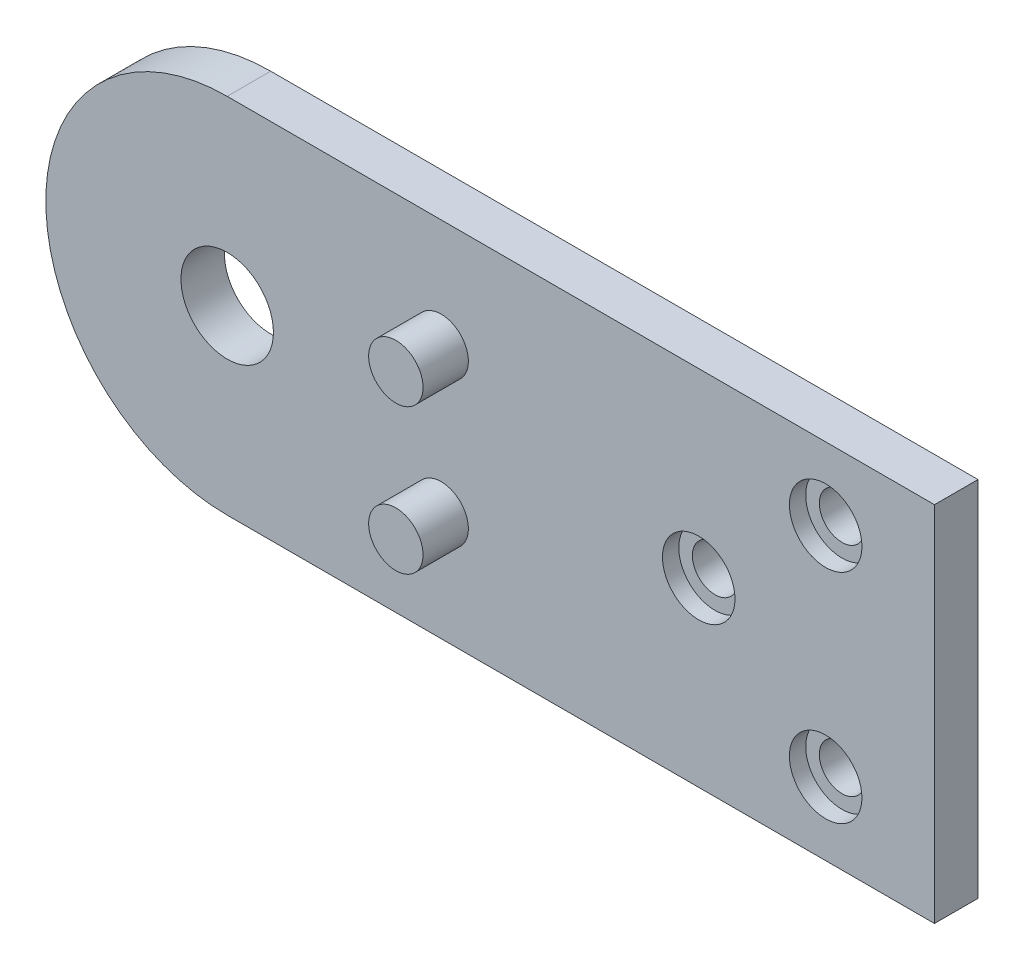
ISO-10303-21;
HEADER;
FILE_DESCRIPTION(('STEP AP214'),'2;1');
FILE_NAME('part.step','',(''),(''),'','','');
FILE_SCHEMA(('AUTOMOTIVE_DESIGN { 1 0 10303 214 1 1 1 1 }'));
ENDSEC;
DATA;
#1=APPLICATION_CONTEXT('core data for automotive mechanical design processes');
#2=APPLICATION_PROTOCOL_DEFINITION('international standard','automotive_design',2000,#1);
#3=PRODUCT_CONTEXT('',#1,'mechanical');
#4=PRODUCT('Part','Part','',(#3));
#5=PRODUCT_RELATED_PRODUCT_CATEGORY('part','',(#4));
#6=PRODUCT_DEFINITION_FORMATION('','',#4);
#7=PRODUCT_DEFINITION_CONTEXT('part definition',#1,'design');
#8=PRODUCT_DEFINITION('design','',#6,#7);
#9=PRODUCT_DEFINITION_SHAPE('','',#8);
#10=(LENGTH_UNIT() NAMED_UNIT(*) SI_UNIT(.MILLI.,.METRE.));
#11=(NAMED_UNIT(*) PLANE_ANGLE_UNIT() SI_UNIT($,.RADIAN.));
#12=(NAMED_UNIT(*) SI_UNIT($,.STERADIAN.) SOLID_ANGLE_UNIT());
#13=UNCERTAINTY_MEASURE_WITH_UNIT(LENGTH_MEASURE(1.E-05),#10,'distance_accuracy_value','');
#14=(GEOMETRIC_REPRESENTATION_CONTEXT(3) GLOBAL_UNCERTAINTY_ASSIGNED_CONTEXT((#13)) GLOBAL_UNIT_ASSIGNED_CONTEXT((#10,
#11,#12)) REPRESENTATION_CONTEXT('',''));
#15=CARTESIAN_POINT('',(0.,0.,0.));
#16=DIRECTION('',(0.,0.,1.));
#17=DIRECTION('',(1.,0.,0.));
#18=AXIS2_PLACEMENT_3D('',#15,#16,#17);
#19=CARTESIAN_POINT('',(26.,1.96131904388899E-12,2.4));
#20=DIRECTION('',(0.,0.,-1.));
#21=DIRECTION('',(-1.,0.,0.));
#22=AXIS2_PLACEMENT_3D('',#19,#20,#21);
#23=CYLINDRICAL_SURFACE('',#22,1.25);
#24=CARTESIAN_POINT('',(26.,1.96131904388899E-12,0.));
#25=DIRECTION('',(0.,0.,-1.));
#26=DIRECTION('',(-1.,0.,0.));
#27=AXIS2_PLACEMENT_3D('',#24,#25,#26);
#28=CIRCLE('',#27,1.25);
#29=CARTESIAN_POINT('',(24.75,1.96131904388899E-12,0.));
#30=VERTEX_POINT('',#29);
#31=EDGE_CURVE('E129',#30,#30,#28,.T.);
#32=ORIENTED_EDGE('',*,*,#31,.T.);
#33=EDGE_LOOP('',(#32));
#34=FACE_BOUND('',#33,.T.);
#35=CARTESIAN_POINT('',(26.,1.96131904388899E-12,1.5));
#36=DIRECTION('',(0.,0.,1.));
#37=DIRECTION('',(1.,0.,0.));
#38=AXIS2_PLACEMENT_3D('',#35,#36,#37);
#39=CIRCLE('',#38,1.25);
#40=CARTESIAN_POINT('',(27.25,1.96131904388899E-12,1.5));
#41=VERTEX_POINT('',#40);
#42=EDGE_CURVE('E138',#41,#41,#39,.F.);
#43=ORIENTED_EDGE('',*,*,#42,.F.);
#44=EDGE_LOOP('',(#43));
#45=FACE_BOUND('',#44,.T.);
#46=ADVANCED_FACE('F56',(#34,#45),#23,.F.);
#47=CARTESIAN_POINT('',(33.,-5.9999999999984,2.4));
#48=DIRECTION('',(0.,0.,-1.));
#49=DIRECTION('',(-1.,0.,0.));
#50=AXIS2_PLACEMENT_3D('',#47,#48,#49);
#51=CYLINDRICAL_SURFACE('',#50,1.25);
#52=CARTESIAN_POINT('',(33.,-5.9999999999984,0.));
#53=DIRECTION('',(0.,0.,-1.));
#54=DIRECTION('',(-1.,0.,0.));
#55=AXIS2_PLACEMENT_3D('',#52,#53,#54);
#56=CIRCLE('',#55,1.25);
#57=CARTESIAN_POINT('',(31.75,-5.9999999999984,0.));
#58=VERTEX_POINT('',#57);
#59=EDGE_CURVE('E132',#58,#58,#56,.T.);
#60=ORIENTED_EDGE('',*,*,#59,.T.);
#61=EDGE_LOOP('',(#60));
#62=FACE_BOUND('',#61,.T.);
#63=CARTESIAN_POINT('',(33.,-5.9999999999984,1.5));
#64=DIRECTION('',(0.,0.,1.));
#65=DIRECTION('',(1.,0.,0.));
#66=AXIS2_PLACEMENT_3D('',#63,#64,#65);
#67=CIRCLE('',#66,1.25);
#68=CARTESIAN_POINT('',(34.25,-5.9999999999984,1.5));
#69=VERTEX_POINT('',#68);
#70=EDGE_CURVE('E149',#69,#69,#67,.F.);
#71=ORIENTED_EDGE('',*,*,#70,.F.);
#72=EDGE_LOOP('',(#71));
#73=FACE_BOUND('',#72,.T.);
#74=ADVANCED_FACE('F214',(#62,#73),#51,.F.);
#75=CARTESIAN_POINT('',(33.,6.0000000000016,2.4));
#76=DIRECTION('',(0.,0.,-1.));
#77=DIRECTION('',(-1.,0.,0.));
#78=AXIS2_PLACEMENT_3D('',#75,#76,#77);
#79=CYLINDRICAL_SURFACE('',#78,1.25);
#80=CARTESIAN_POINT('',(33.,6.0000000000016,0.));
#81=DIRECTION('',(0.,0.,-1.));
#82=DIRECTION('',(-1.,0.,0.));
#83=AXIS2_PLACEMENT_3D('',#80,#81,#82);
#84=CIRCLE('',#83,1.25);
#85=CARTESIAN_POINT('',(31.75,6.0000000000016,0.));
#86=VERTEX_POINT('',#85);
#87=EDGE_CURVE('E120',#86,#86,#84,.T.);
#88=ORIENTED_EDGE('',*,*,#87,.T.);
#89=EDGE_LOOP('',(#88));
#90=FACE_BOUND('',#89,.T.);
#91=CARTESIAN_POINT('',(33.,6.0000000000016,1.5));
#92=DIRECTION('',(0.,0.,1.));
#93=DIRECTION('',(1.,0.,0.));
#94=AXIS2_PLACEMENT_3D('',#91,#92,#93);
#95=CIRCLE('',#94,1.25);
#96=CARTESIAN_POINT('',(34.25,6.0000000000016,1.5));
#97=VERTEX_POINT('',#96);
#98=EDGE_CURVE('E133',#97,#97,#95,.F.);
#99=ORIENTED_EDGE('',*,*,#98,.F.);
#100=EDGE_LOOP('',(#99));
#101=FACE_BOUND('',#100,.T.);
#102=ADVANCED_FACE('F220',(#90,#101),#79,.F.);
#103=CARTESIAN_POINT('',(0.,0.,0.));
#104=DIRECTION('',(0.,0.,1.));
#105=DIRECTION('',(1.,0.,0.));
#106=AXIS2_PLACEMENT_3D('',#103,#104,#105);
#107=PLANE('',#106);
#108=CARTESIAN_POINT('',(0.,0.,0.));
#109=DIRECTION('',(0.,0.,1.));
#110=DIRECTION('',(1.,0.,0.));
#111=AXIS2_PLACEMENT_3D('',#108,#109,#110);
#112=CIRCLE('',#111,2.55);
#113=CARTESIAN_POINT('',(2.55,0.,0.));
#114=VERTEX_POINT('',#113);
#115=EDGE_CURVE('E146',#114,#114,#112,.T.);
#116=ORIENTED_EDGE('',*,*,#115,.T.);
#117=EDGE_LOOP('',(#116));
#118=FACE_BOUND('',#117,.T.);
#119=ORIENTED_EDGE('',*,*,#87,.F.);
#120=EDGE_LOOP('',(#119));
#121=FACE_BOUND('',#120,.T.);
#122=ORIENTED_EDGE('',*,*,#59,.F.);
#123=EDGE_LOOP('',(#122));
#124=FACE_BOUND('',#123,.T.);
#125=ORIENTED_EDGE('',*,*,#31,.F.);
#126=EDGE_LOOP('',(#125));
#127=FACE_BOUND('',#126,.T.);
#128=CARTESIAN_POINT('',(0.,0.,0.));
#129=DIRECTION('',(0.,0.,1.));
#130=DIRECTION('',(1.,0.,0.));
#131=AXIS2_PLACEMENT_3D('',#128,#129,#130);
#132=CIRCLE('',#131,10.);
#133=CARTESIAN_POINT('',(0.,10.,0.));
#134=VERTEX_POINT('',#133);
#135=CARTESIAN_POINT('',(0.,-10.,0.));
#136=VERTEX_POINT('',#135);
#137=EDGE_CURVE('E113',#134,#136,#132,.T.);
#138=ORIENTED_EDGE('',*,*,#137,.F.);
#139=DIRECTION('',(1.,0.,0.));
#140=VECTOR('',#139,1.);
#141=CARTESIAN_POINT('',(0.,10.,0.));
#142=LINE('',#141,#140);
#143=CARTESIAN_POINT('',(39.,10.,0.));
#144=VERTEX_POINT('',#143);
#145=EDGE_CURVE('E100',#134,#144,#142,.T.);
#146=ORIENTED_EDGE('',*,*,#145,.T.);
#147=DIRECTION('',(0.,-1.,0.));
#148=VECTOR('',#147,1.);
#149=CARTESIAN_POINT('',(39.,10.,0.));
#150=LINE('',#149,#148);
#151=CARTESIAN_POINT('',(39.,-10.,0.));
#152=VERTEX_POINT('',#151);
#153=EDGE_CURVE('E106',#144,#152,#150,.T.);
#154=ORIENTED_EDGE('',*,*,#153,.T.);
#155=DIRECTION('',(1.,0.,0.));
#156=VECTOR('',#155,1.);
#157=CARTESIAN_POINT('',(0.,-10.,0.));
#158=LINE('',#157,#156);
#159=EDGE_CURVE('E110',#136,#152,#158,.T.);
#160=ORIENTED_EDGE('',*,*,#159,.F.);
#161=EDGE_LOOP('',(#138,#146,#154,#160));
#162=FACE_BOUND('',#161,.T.);
#163=ADVANCED_FACE('F112',(#118,#121,#124,#127,#162),#107,.F.);
#164=CARTESIAN_POINT('',(0.,0.,2.4));
#165=DIRECTION('',(0.,0.,1.));
#166=DIRECTION('',(1.,0.,0.));
#167=AXIS2_PLACEMENT_3D('',#164,#165,#166);
#168=PLANE('',#167);
#169=CARTESIAN_POINT('',(11.8,4.00000000000002,2.4));
#170=DIRECTION('',(0.,0.,1.));
#171=DIRECTION('',(1.,0.,0.));
#172=AXIS2_PLACEMENT_3D('',#169,#170,#171);
#173=CIRCLE('',#172,1.5);
#174=CARTESIAN_POINT('',(13.3,4.00000000000002,2.4));
#175=VERTEX_POINT('',#174);
#176=EDGE_CURVE('E174',#175,#175,#173,.T.);
#177=ORIENTED_EDGE('',*,*,#176,.F.);
#178=EDGE_LOOP('',(#177));
#179=FACE_BOUND('',#178,.T.);
#180=CARTESIAN_POINT('',(11.8,-3.99999999999998,2.4));
#181=DIRECTION('',(0.,0.,1.));
#182=DIRECTION('',(1.,0.,0.));
#183=AXIS2_PLACEMENT_3D('',#180,#181,#182);
#184=CIRCLE('',#183,1.5);
#185=CARTESIAN_POINT('',(13.3,-3.99999999999998,2.4));
#186=VERTEX_POINT('',#185);
#187=EDGE_CURVE('E171',#186,#186,#184,.T.);
#188=ORIENTED_EDGE('',*,*,#187,.F.);
#189=EDGE_LOOP('',(#188));
#190=FACE_BOUND('',#189,.T.);
#191=CARTESIAN_POINT('',(0.,0.,2.4));
#192=DIRECTION('',(0.,0.,1.));
#193=DIRECTION('',(1.,0.,0.));
#194=AXIS2_PLACEMENT_3D('',#191,#192,#193);
#195=CIRCLE('',#194,2.55);
#196=CARTESIAN_POINT('',(2.55,0.,2.4));
#197=VERTEX_POINT('',#196);
#198=EDGE_CURVE('E165',#197,#197,#195,.T.);
#199=ORIENTED_EDGE('',*,*,#198,.F.);
#200=EDGE_LOOP('',(#199));
#201=FACE_BOUND('',#200,.T.);
#202=CARTESIAN_POINT('',(33.,6.0000000000016,2.4));
#203=DIRECTION('',(0.,0.,1.));
#204=DIRECTION('',(1.,0.,0.));
#205=AXIS2_PLACEMENT_3D('',#202,#203,#204);
#206=CIRCLE('',#205,2.);
#207=CARTESIAN_POINT('',(35.,6.0000000000016,2.4));
#208=VERTEX_POINT('',#207);
#209=EDGE_CURVE('E152',#208,#208,#206,.T.);
#210=ORIENTED_EDGE('',*,*,#209,.F.);
#211=EDGE_LOOP('',(#210));
#212=FACE_BOUND('',#211,.T.);
#213=CARTESIAN_POINT('',(33.,-5.9999999999984,2.4));
#214=DIRECTION('',(0.,0.,1.));
#215=DIRECTION('',(1.,0.,0.));
#216=AXIS2_PLACEMENT_3D('',#213,#214,#215);
#217=CIRCLE('',#216,2.);
#218=CARTESIAN_POINT('',(35.,-5.9999999999984,2.4));
#219=VERTEX_POINT('',#218);
#220=EDGE_CURVE('E141',#219,#219,#217,.T.);
#221=ORIENTED_EDGE('',*,*,#220,.F.);
#222=EDGE_LOOP('',(#221));
#223=FACE_BOUND('',#222,.T.);
#224=CARTESIAN_POINT('',(26.,1.96131904388899E-12,2.4));
#225=DIRECTION('',(0.,0.,1.));
#226=DIRECTION('',(1.,0.,0.));
#227=AXIS2_PLACEMENT_3D('',#224,#225,#226);
#228=CIRCLE('',#227,2.);
#229=CARTESIAN_POINT('',(28.,1.96131904388899E-12,2.4));
#230=VERTEX_POINT('',#229);
#231=EDGE_CURVE('E143',#230,#230,#228,.T.);
#232=ORIENTED_EDGE('',*,*,#231,.F.);
#233=EDGE_LOOP('',(#232));
#234=FACE_BOUND('',#233,.T.);
#235=CARTESIAN_POINT('',(0.,0.,2.4));
#236=DIRECTION('',(0.,0.,1.));
#237=DIRECTION('',(1.,0.,0.));
#238=AXIS2_PLACEMENT_3D('',#235,#236,#237);
#239=CIRCLE('',#238,10.);
#240=CARTESIAN_POINT('',(0.,10.,2.4));
#241=VERTEX_POINT('',#240);
#242=CARTESIAN_POINT('',(0.,-10.,2.4));
#243=VERTEX_POINT('',#242);
#244=EDGE_CURVE('E125',#241,#243,#239,.T.);
#245=ORIENTED_EDGE('',*,*,#244,.T.);
#246=DIRECTION('',(1.,0.,0.));
#247=VECTOR('',#246,1.);
#248=CARTESIAN_POINT('',(0.,-10.,2.4));
#249=LINE('',#248,#247);
#250=CARTESIAN_POINT('',(39.,-10.,2.4));
#251=VERTEX_POINT('',#250);
#252=EDGE_CURVE('E114',#243,#251,#249,.T.);
#253=ORIENTED_EDGE('',*,*,#252,.T.);
#254=DIRECTION('',(0.,-1.,0.));
#255=VECTOR('',#254,1.);
#256=CARTESIAN_POINT('',(39.,10.,2.4));
#257=LINE('',#256,#255);
#258=CARTESIAN_POINT('',(39.,10.,2.4));
#259=VERTEX_POINT('',#258);
#260=EDGE_CURVE('E116',#259,#251,#257,.T.);
#261=ORIENTED_EDGE('',*,*,#260,.F.);
#262=DIRECTION('',(1.,0.,0.));
#263=VECTOR('',#262,1.);
#264=CARTESIAN_POINT('',(0.,10.,2.4));
#265=LINE('',#264,#263);
#266=EDGE_CURVE('E103',#241,#259,#265,.T.);
#267=ORIENTED_EDGE('',*,*,#266,.F.);
#268=EDGE_LOOP('',(#245,#253,#261,#267));
#269=FACE_BOUND('',#268,.T.);
#270=ADVANCED_FACE('F185',(#179,#190,#201,#212,#223,#234,#269),#168,.T.);
#271=CARTESIAN_POINT('',(0.,0.,2.4));
#272=DIRECTION('',(0.,0.,-1.));
#273=DIRECTION('',(-1.,0.,0.));
#274=AXIS2_PLACEMENT_3D('',#271,#272,#273);
#275=CYLINDRICAL_SURFACE('',#274,10.);
#276=DIRECTION('',(0.,0.,-1.));
#277=VECTOR('',#276,1.);
#278=CARTESIAN_POINT('',(0.,-10.,2.4));
#279=LINE('',#278,#277);
#280=EDGE_CURVE('E13',#243,#136,#279,.T.);
#281=ORIENTED_EDGE('',*,*,#280,.F.);
#282=ORIENTED_EDGE('',*,*,#244,.F.);
#283=DIRECTION('',(0.,0.,-1.));
#284=VECTOR('',#283,1.);
#285=CARTESIAN_POINT('',(0.,10.,2.4));
#286=LINE('',#285,#284);
#287=EDGE_CURVE('E66',#241,#134,#286,.T.);
#288=ORIENTED_EDGE('',*,*,#287,.T.);
#289=ORIENTED_EDGE('',*,*,#137,.T.);
#290=EDGE_LOOP('',(#281,#282,#288,#289));
#291=FACE_BOUND('',#290,.T.);
#292=ADVANCED_FACE('F188',(#291),#275,.T.);
#293=CARTESIAN_POINT('',(39.,10.,2.4));
#294=DIRECTION('',(1.,0.,0.));
#295=DIRECTION('',(0.,0.,-1.));
#296=AXIS2_PLACEMENT_3D('',#293,#294,#295);
#297=PLANE('',#296);
#298=ORIENTED_EDGE('',*,*,#153,.F.);
#299=DIRECTION('',(0.,0.,-1.));
#300=VECTOR('',#299,1.);
#301=CARTESIAN_POINT('',(39.,10.,2.4));
#302=LINE('',#301,#300);
#303=EDGE_CURVE('E97',#259,#144,#302,.T.);
#304=ORIENTED_EDGE('',*,*,#303,.F.);
#305=ORIENTED_EDGE('',*,*,#260,.T.);
#306=DIRECTION('',(0.,0.,-1.));
#307=VECTOR('',#306,1.);
#308=CARTESIAN_POINT('',(39.,-10.,2.4));
#309=LINE('',#308,#307);
#310=EDGE_CURVE('E60',#251,#152,#309,.T.);
#311=ORIENTED_EDGE('',*,*,#310,.T.);
#312=EDGE_LOOP('',(#298,#304,#305,#311));
#313=FACE_BOUND('',#312,.T.);
#314=ADVANCED_FACE('F107',(#313),#297,.T.);
#315=CARTESIAN_POINT('',(0.,10.,2.4));
#316=DIRECTION('',(0.,1.,0.));
#317=DIRECTION('',(0.,0.,1.));
#318=AXIS2_PLACEMENT_3D('',#315,#316,#317);
#319=PLANE('',#318);
#320=ORIENTED_EDGE('',*,*,#145,.F.);
#321=ORIENTED_EDGE('',*,*,#287,.F.);
#322=ORIENTED_EDGE('',*,*,#266,.T.);
#323=ORIENTED_EDGE('',*,*,#303,.T.);
#324=EDGE_LOOP('',(#320,#321,#322,#323));
#325=FACE_BOUND('',#324,.T.);
#326=ADVANCED_FACE('F98',(#325),#319,.T.);
#327=CARTESIAN_POINT('',(0.,-10.,2.4));
#328=DIRECTION('',(0.,1.,0.));
#329=DIRECTION('',(0.,0.,1.));
#330=AXIS2_PLACEMENT_3D('',#327,#328,#329);
#331=PLANE('',#330);
#332=ORIENTED_EDGE('',*,*,#159,.T.);
#333=ORIENTED_EDGE('',*,*,#310,.F.);
#334=ORIENTED_EDGE('',*,*,#252,.F.);
#335=ORIENTED_EDGE('',*,*,#280,.T.);
#336=EDGE_LOOP('',(#332,#333,#334,#335));
#337=FACE_BOUND('',#336,.T.);
#338=ADVANCED_FACE('F58',(#337),#331,.F.);
#339=CARTESIAN_POINT('',(33.,6.0000000000016,-5.65685424949239));
#340=DIRECTION('',(0.,0.,1.));
#341=DIRECTION('',(1.,0.,0.));
#342=AXIS2_PLACEMENT_3D('',#339,#340,#341);
#343=CYLINDRICAL_SURFACE('',#342,2.);
#344=CARTESIAN_POINT('',(33.,6.0000000000016,1.5));
#345=DIRECTION('',(0.,0.,1.));
#346=DIRECTION('',(1.,0.,0.));
#347=AXIS2_PLACEMENT_3D('',#344,#345,#346);
#348=CIRCLE('',#347,2.);
#349=CARTESIAN_POINT('',(35.,6.0000000000016,1.5));
#350=VERTEX_POINT('',#349);
#351=EDGE_CURVE('E160',#350,#350,#348,.F.);
#352=ORIENTED_EDGE('',*,*,#351,.T.);
#353=EDGE_LOOP('',(#352));
#354=FACE_BOUND('',#353,.T.);
#355=ORIENTED_EDGE('',*,*,#209,.T.);
#356=EDGE_LOOP('',(#355));
#357=FACE_BOUND('',#356,.T.);
#358=ADVANCED_FACE('F203',(#354,#357),#343,.F.);
#359=CARTESIAN_POINT('',(0.,0.,1.5));
#360=DIRECTION('',(0.,0.,1.));
#361=DIRECTION('',(1.,0.,0.));
#362=AXIS2_PLACEMENT_3D('',#359,#360,#361);
#363=PLANE('',#362);
#364=ORIENTED_EDGE('',*,*,#351,.F.);
#365=EDGE_LOOP('',(#364));
#366=FACE_BOUND('',#365,.T.);
#367=ORIENTED_EDGE('',*,*,#98,.T.);
#368=EDGE_LOOP('',(#367));
#369=FACE_BOUND('',#368,.T.);
#370=ADVANCED_FACE('F208',(#366,#369),#363,.T.);
#371=CARTESIAN_POINT('',(33.,-5.9999999999984,-5.65685424949239));
#372=DIRECTION('',(0.,0.,1.));
#373=DIRECTION('',(1.,0.,0.));
#374=AXIS2_PLACEMENT_3D('',#371,#372,#373);
#375=CYLINDRICAL_SURFACE('',#374,2.);
#376=CARTESIAN_POINT('',(33.,-5.9999999999984,1.5));
#377=DIRECTION('',(0.,0.,1.));
#378=DIRECTION('',(1.,0.,0.));
#379=AXIS2_PLACEMENT_3D('',#376,#377,#378);
#380=CIRCLE('',#379,2.);
#381=CARTESIAN_POINT('',(35.,-5.9999999999984,1.5));
#382=VERTEX_POINT('',#381);
#383=EDGE_CURVE('E153',#382,#382,#380,.F.);
#384=ORIENTED_EDGE('',*,*,#383,.T.);
#385=EDGE_LOOP('',(#384));
#386=FACE_BOUND('',#385,.T.);
#387=ORIENTED_EDGE('',*,*,#220,.T.);
#388=EDGE_LOOP('',(#387));
#389=FACE_BOUND('',#388,.T.);
#390=ADVANCED_FACE('F282',(#386,#389),#375,.F.);
#391=CARTESIAN_POINT('',(0.,0.,1.5));
#392=DIRECTION('',(0.,0.,1.));
#393=DIRECTION('',(1.,0.,0.));
#394=AXIS2_PLACEMENT_3D('',#391,#392,#393);
#395=PLANE('',#394);
#396=ORIENTED_EDGE('',*,*,#383,.F.);
#397=EDGE_LOOP('',(#396));
#398=FACE_BOUND('',#397,.T.);
#399=ORIENTED_EDGE('',*,*,#70,.T.);
#400=EDGE_LOOP('',(#399));
#401=FACE_BOUND('',#400,.T.);
#402=ADVANCED_FACE('F293',(#398,#401),#395,.T.);
#403=CARTESIAN_POINT('',(26.,1.96131904388899E-12,-5.65685424949239));
#404=DIRECTION('',(0.,0.,1.));
#405=DIRECTION('',(1.,0.,0.));
#406=AXIS2_PLACEMENT_3D('',#403,#404,#405);
#407=CYLINDRICAL_SURFACE('',#406,2.);
#408=CARTESIAN_POINT('',(26.,1.96131904388899E-12,1.5));
#409=DIRECTION('',(0.,0.,1.));
#410=DIRECTION('',(1.,0.,0.));
#411=AXIS2_PLACEMENT_3D('',#408,#409,#410);
#412=CIRCLE('',#411,2.);
#413=CARTESIAN_POINT('',(28.,1.96131904388899E-12,1.5));
#414=VERTEX_POINT('',#413);
#415=EDGE_CURVE('E142',#414,#414,#412,.F.);
#416=ORIENTED_EDGE('',*,*,#415,.T.);
#417=EDGE_LOOP('',(#416));
#418=FACE_BOUND('',#417,.T.);
#419=ORIENTED_EDGE('',*,*,#231,.T.);
#420=EDGE_LOOP('',(#419));
#421=FACE_BOUND('',#420,.T.);
#422=ADVANCED_FACE('F304',(#418,#421),#407,.F.);
#423=CARTESIAN_POINT('',(0.,0.,1.5));
#424=DIRECTION('',(0.,0.,1.));
#425=DIRECTION('',(1.,0.,0.));
#426=AXIS2_PLACEMENT_3D('',#423,#424,#425);
#427=PLANE('',#426);
#428=ORIENTED_EDGE('',*,*,#415,.F.);
#429=EDGE_LOOP('',(#428));
#430=FACE_BOUND('',#429,.T.);
#431=ORIENTED_EDGE('',*,*,#42,.T.);
#432=EDGE_LOOP('',(#431));
#433=FACE_BOUND('',#432,.T.);
#434=ADVANCED_FACE('F315',(#430,#433),#427,.T.);
#435=CARTESIAN_POINT('',(0.,0.,0.));
#436=DIRECTION('',(0.,0.,1.));
#437=DIRECTION('',(1.,0.,0.));
#438=AXIS2_PLACEMENT_3D('',#435,#436,#437);
#439=CYLINDRICAL_SURFACE('',#438,2.55);
#440=ORIENTED_EDGE('',*,*,#115,.F.);
#441=EDGE_LOOP('',(#440));
#442=FACE_BOUND('',#441,.T.);
#443=ORIENTED_EDGE('',*,*,#198,.T.);
#444=EDGE_LOOP('',(#443));
#445=FACE_BOUND('',#444,.T.);
#446=ADVANCED_FACE('F326',(#442,#445),#439,.F.);
#447=CARTESIAN_POINT('',(11.8,-3.99999999999998,4.9));
#448=DIRECTION('',(0.,0.,-1.));
#449=DIRECTION('',(-1.,0.,0.));
#450=AXIS2_PLACEMENT_3D('',#447,#448,#449);
#451=CYLINDRICAL_SURFACE('',#450,1.5);
#452=CARTESIAN_POINT('',(11.8,-3.99999999999998,4.9));
#453=DIRECTION('',(0.,0.,1.));
#454=DIRECTION('',(1.,0.,0.));
#455=AXIS2_PLACEMENT_3D('',#452,#453,#454);
#456=CIRCLE('',#455,1.5);
#457=CARTESIAN_POINT('',(13.3,-3.99999999999998,4.9));
#458=VERTEX_POINT('',#457);
#459=EDGE_CURVE('E168',#458,#458,#456,.T.);
#460=ORIENTED_EDGE('',*,*,#459,.F.);
#461=EDGE_LOOP('',(#460));
#462=FACE_BOUND('',#461,.T.);
#463=ORIENTED_EDGE('',*,*,#187,.T.);
#464=EDGE_LOOP('',(#463));
#465=FACE_BOUND('',#464,.T.);
#466=ADVANCED_FACE('F344',(#462,#465),#451,.T.);
#467=CARTESIAN_POINT('',(11.8,-3.99999999999998,4.9));
#468=DIRECTION('',(0.,0.,1.));
#469=DIRECTION('',(1.,0.,0.));
#470=AXIS2_PLACEMENT_3D('',#467,#468,#469);
#471=PLANE('',#470);
#472=ORIENTED_EDGE('',*,*,#459,.T.);
#473=EDGE_LOOP('',(#472));
#474=FACE_BOUND('',#473,.T.);
#475=ADVANCED_FACE('F360',(#474),#471,.T.);
#476=CARTESIAN_POINT('',(11.8,4.00000000000002,4.9));
#477=DIRECTION('',(0.,0.,-1.));
#478=DIRECTION('',(-1.,0.,0.));
#479=AXIS2_PLACEMENT_3D('',#476,#477,#478);
#480=CYLINDRICAL_SURFACE('',#479,1.5);
#481=CARTESIAN_POINT('',(11.8,4.00000000000002,4.9));
#482=DIRECTION('',(0.,0.,1.));
#483=DIRECTION('',(1.,0.,0.));
#484=AXIS2_PLACEMENT_3D('',#481,#482,#483);
#485=CIRCLE('',#484,1.5);
#486=CARTESIAN_POINT('',(13.3,4.00000000000002,4.9));
#487=VERTEX_POINT('',#486);
#488=EDGE_CURVE('E177',#487,#487,#485,.T.);
#489=ORIENTED_EDGE('',*,*,#488,.F.);
#490=EDGE_LOOP('',(#489));
#491=FACE_BOUND('',#490,.T.);
#492=ORIENTED_EDGE('',*,*,#176,.T.);
#493=EDGE_LOOP('',(#492));
#494=FACE_BOUND('',#493,.T.);
#495=ADVANCED_FACE('F183',(#491,#494),#480,.T.);
#496=CARTESIAN_POINT('',(11.8,4.00000000000002,4.9));
#497=DIRECTION('',(0.,0.,1.));
#498=DIRECTION('',(1.,0.,0.));
#499=AXIS2_PLACEMENT_3D('',#496,#497,#498);
#500=PLANE('',#499);
#501=ORIENTED_EDGE('',*,*,#488,.T.);
#502=EDGE_LOOP('',(#501));
#503=FACE_BOUND('',#502,.T.);
#504=ADVANCED_FACE('F381',(#503),#500,.T.);
#505=CLOSED_SHELL('',(#46,#74,#102,#163,#270,#292,#314,#326,#338,#358,#370,#390,#402,#422,#434,
#446,#466,#475,#495,#504));
#506=MANIFOLD_SOLID_BREP('B2',#505);
#507=ADVANCED_BREP_SHAPE_REPRESENTATION('',(#18,#506),#14);
#508=SHAPE_DEFINITION_REPRESENTATION(#9,#507);
ENDSEC;
END-ISO-10303-21;
